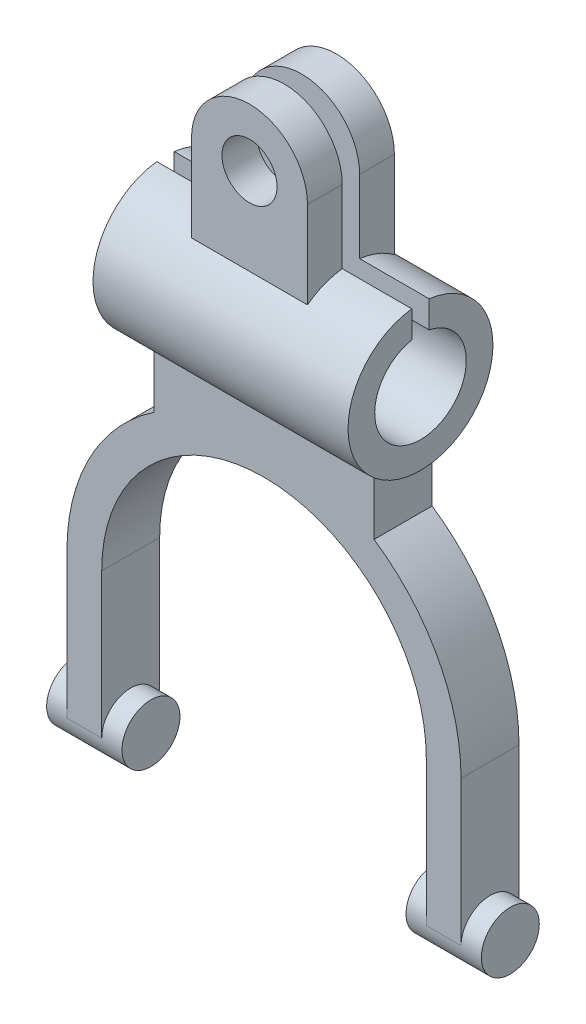
ISO-10303-21;
HEADER;
FILE_DESCRIPTION(('STEP AP214'),'2;1');
FILE_NAME('part.step','',(''),(''),'','','');
FILE_SCHEMA(('AUTOMOTIVE_DESIGN { 1 0 10303 214 1 1 1 1 }'));
ENDSEC;
DATA;
#1=APPLICATION_CONTEXT('core data for automotive mechanical design processes');
#2=APPLICATION_PROTOCOL_DEFINITION('international standard','automotive_design',2000,#1);
#3=PRODUCT_CONTEXT('',#1,'mechanical');
#4=PRODUCT('Part','Part','',(#3));
#5=PRODUCT_RELATED_PRODUCT_CATEGORY('part','',(#4));
#6=PRODUCT_DEFINITION_FORMATION('','',#4);
#7=PRODUCT_DEFINITION_CONTEXT('part definition',#1,'design');
#8=PRODUCT_DEFINITION('design','',#6,#7);
#9=PRODUCT_DEFINITION_SHAPE('','',#8);
#10=(LENGTH_UNIT() NAMED_UNIT(*) SI_UNIT(.MILLI.,.METRE.));
#11=(NAMED_UNIT(*) PLANE_ANGLE_UNIT() SI_UNIT($,.RADIAN.));
#12=(NAMED_UNIT(*) SI_UNIT($,.STERADIAN.) SOLID_ANGLE_UNIT());
#13=UNCERTAINTY_MEASURE_WITH_UNIT(LENGTH_MEASURE(1.E-05),#10,'distance_accuracy_value','');
#14=(GEOMETRIC_REPRESENTATION_CONTEXT(3) GLOBAL_UNCERTAINTY_ASSIGNED_CONTEXT((#13)) GLOBAL_UNIT_ASSIGNED_CONTEXT((#10,
#11,#12)) REPRESENTATION_CONTEXT('',''));
#15=CARTESIAN_POINT('',(0.,0.,0.));
#16=DIRECTION('',(0.,0.,1.));
#17=DIRECTION('',(1.,0.,0.));
#18=AXIS2_PLACEMENT_3D('',#15,#16,#17);
#19=CARTESIAN_POINT('',(22.,0.,0.));
#20=DIRECTION('',(-1.,0.,0.));
#21=DIRECTION('',(0.,0.,1.));
#22=AXIS2_PLACEMENT_3D('',#19,#20,#21);
#23=CYLINDRICAL_SURFACE('',#22,12.5);
#24=CARTESIAN_POINT('',(-19.,0.,0.));
#25=DIRECTION('',(1.,0.,0.));
#26=DIRECTION('',(0.,0.,-1.));
#27=AXIS2_PLACEMENT_3D('',#24,#25,#26);
#28=CIRCLE('',#27,12.5);
#29=CARTESIAN_POINT('',(-19.,-11.4564392373896,5.));
#30=VERTEX_POINT('',#29);
#31=CARTESIAN_POINT('',(-19.,-11.4564392373896,-5.));
#32=VERTEX_POINT('',#31);
#33=EDGE_CURVE('E61',#30,#32,#28,.T.);
#34=ORIENTED_EDGE('',*,*,#33,.F.);
#35=DIRECTION('',(-1.,0.,0.));
#36=VECTOR('',#35,1.);
#37=CARTESIAN_POINT('',(22.,-11.4564392373896,5.));
#38=LINE('',#37,#36);
#39=CARTESIAN_POINT('',(19.,-11.4564392373896,5.));
#40=VERTEX_POINT('',#39);
#41=EDGE_CURVE('E390',#30,#40,#38,.F.);
#42=ORIENTED_EDGE('',*,*,#41,.T.);
#43=CARTESIAN_POINT('',(19.,0.,0.));
#44=DIRECTION('',(-1.,0.,0.));
#45=DIRECTION('',(0.,0.,1.));
#46=AXIS2_PLACEMENT_3D('',#43,#44,#45);
#47=CIRCLE('',#46,12.5);
#48=CARTESIAN_POINT('',(19.,-11.4564392373896,-5.));
#49=VERTEX_POINT('',#48);
#50=EDGE_CURVE('E386',#49,#40,#47,.T.);
#51=ORIENTED_EDGE('',*,*,#50,.F.);
#52=DIRECTION('',(-1.,0.,0.));
#53=VECTOR('',#52,1.);
#54=CARTESIAN_POINT('',(22.,-11.4564392373896,-5.));
#55=LINE('',#54,#53);
#56=EDGE_CURVE('E383',#32,#49,#55,.F.);
#57=ORIENTED_EDGE('',*,*,#56,.F.);
#58=EDGE_LOOP('',(#34,#42,#51,#57));
#59=FACE_BOUND('',#58,.T.);
#60=DIRECTION('',(-1.,0.,0.));
#61=VECTOR('',#60,1.);
#62=CARTESIAN_POINT('',(22.,12.4096736459909,1.5));
#63=LINE('',#62,#61);
#64=CARTESIAN_POINT('',(-22.,12.4096736459909,1.5));
#65=VERTEX_POINT('',#64);
#66=CARTESIAN_POINT('',(-10.,12.4096736459909,1.5));
#67=VERTEX_POINT('',#66);
#68=EDGE_CURVE('E242',#65,#67,#63,.F.);
#69=ORIENTED_EDGE('',*,*,#68,.F.);
#70=CARTESIAN_POINT('',(-22.,0.,0.));
#71=DIRECTION('',(1.,0.,0.));
#72=DIRECTION('',(0.,0.,-1.));
#73=AXIS2_PLACEMENT_3D('',#70,#71,#72);
#74=CIRCLE('',#73,12.5);
#75=CARTESIAN_POINT('',(-22.,12.4096736459909,-1.5));
#76=VERTEX_POINT('',#75);
#77=EDGE_CURVE('E365',#65,#76,#74,.T.);
#78=ORIENTED_EDGE('',*,*,#77,.T.);
#79=DIRECTION('',(-1.,0.,0.));
#80=VECTOR('',#79,1.);
#81=CARTESIAN_POINT('',(22.,12.4096736459909,-1.5));
#82=LINE('',#81,#80);
#83=CARTESIAN_POINT('',(-10.,12.4096736459909,-1.5));
#84=VERTEX_POINT('',#83);
#85=EDGE_CURVE('E231',#84,#76,#82,.T.);
#86=ORIENTED_EDGE('',*,*,#85,.F.);
#87=CARTESIAN_POINT('',(-9.99999999999999,0.,0.));
#88=DIRECTION('',(1.,0.,0.));
#89=DIRECTION('',(0.,1.,0.));
#90=AXIS2_PLACEMENT_3D('',#87,#88,#89);
#91=CIRCLE('',#90,12.5);
#92=CARTESIAN_POINT('',(-10.,10.,-7.5));
#93=VERTEX_POINT('',#92);
#94=EDGE_CURVE('E380',#93,#84,#91,.T.);
#95=ORIENTED_EDGE('',*,*,#94,.F.);
#96=DIRECTION('',(-1.,0.,0.));
#97=VECTOR('',#96,1.);
#98=CARTESIAN_POINT('',(22.,10.,-7.5));
#99=LINE('',#98,#97);
#100=CARTESIAN_POINT('',(10.,10.,-7.5));
#101=VERTEX_POINT('',#100);
#102=EDGE_CURVE('E373',#101,#93,#99,.T.);
#103=ORIENTED_EDGE('',*,*,#102,.F.);
#104=CARTESIAN_POINT('',(10.,0.,0.));
#105=DIRECTION('',(-1.,0.,0.));
#106=DIRECTION('',(0.,0.,1.));
#107=AXIS2_PLACEMENT_3D('',#104,#105,#106);
#108=CIRCLE('',#107,12.5);
#109=CARTESIAN_POINT('',(10.,12.4096736459909,-1.5));
#110=VERTEX_POINT('',#109);
#111=EDGE_CURVE('E367',#110,#101,#108,.T.);
#112=ORIENTED_EDGE('',*,*,#111,.F.);
#113=CARTESIAN_POINT('',(22.,12.4096736459909,-1.5));
#114=VERTEX_POINT('',#113);
#115=EDGE_CURVE('E53',#114,#110,#82,.T.);
#116=ORIENTED_EDGE('',*,*,#115,.F.);
#117=CARTESIAN_POINT('',(22.,0.,0.));
#118=DIRECTION('',(1.,0.,0.));
#119=DIRECTION('',(0.,0.,-1.));
#120=AXIS2_PLACEMENT_3D('',#117,#118,#119);
#121=CIRCLE('',#120,12.5);
#122=CARTESIAN_POINT('',(22.,12.4096736459909,1.5));
#123=VERTEX_POINT('',#122);
#124=EDGE_CURVE('E219',#123,#114,#121,.T.);
#125=ORIENTED_EDGE('',*,*,#124,.F.);
#126=CARTESIAN_POINT('',(10.,12.4096736459909,1.5));
#127=VERTEX_POINT('',#126);
#128=EDGE_CURVE('E239',#127,#123,#63,.F.);
#129=ORIENTED_EDGE('',*,*,#128,.F.);
#130=CARTESIAN_POINT('',(10.,10.,7.5));
#131=VERTEX_POINT('',#130);
#132=EDGE_CURVE('E370',#131,#127,#108,.T.);
#133=ORIENTED_EDGE('',*,*,#132,.F.);
#134=DIRECTION('',(-1.,0.,0.));
#135=VECTOR('',#134,1.);
#136=CARTESIAN_POINT('',(22.,10.,7.5));
#137=LINE('',#136,#135);
#138=CARTESIAN_POINT('',(-10.,10.,7.5));
#139=VERTEX_POINT('',#138);
#140=EDGE_CURVE('E376',#131,#139,#137,.T.);
#141=ORIENTED_EDGE('',*,*,#140,.T.);
#142=EDGE_CURVE('E379',#67,#139,#91,.T.);
#143=ORIENTED_EDGE('',*,*,#142,.F.);
#144=EDGE_LOOP('',(#69,#78,#86,#95,#103,#112,#116,#125,#129,#133,#141,#143));
#145=FACE_BOUND('',#144,.T.);
#146=ADVANCED_FACE('F39',(#59,#145),#23,.T.);
#147=CARTESIAN_POINT('',(22.,0.,0.));
#148=DIRECTION('',(1.,0.,0.));
#149=DIRECTION('',(0.,0.,-1.));
#150=AXIS2_PLACEMENT_3D('',#147,#148,#149);
#151=PLANE('',#150);
#152=CARTESIAN_POINT('',(22.,0.,0.));
#153=DIRECTION('',(1.,0.,0.));
#154=DIRECTION('',(0.,0.,-1.));
#155=AXIS2_PLACEMENT_3D('',#152,#153,#154);
#156=CIRCLE('',#155,7.9);
#157=CARTESIAN_POINT('',(22.,7.75628777186613,1.5));
#158=VERTEX_POINT('',#157);
#159=CARTESIAN_POINT('',(22.,7.75628777186613,-1.5));
#160=VERTEX_POINT('',#159);
#161=EDGE_CURVE('E209',#158,#160,#156,.T.);
#162=ORIENTED_EDGE('',*,*,#161,.F.);
#163=DIRECTION('',(0.,1.,0.));
#164=VECTOR('',#163,1.);
#165=CARTESIAN_POINT('',(22.,0.,1.5));
#166=LINE('',#165,#164);
#167=EDGE_CURVE('E206',#158,#123,#166,.T.);
#168=ORIENTED_EDGE('',*,*,#167,.T.);
#169=ORIENTED_EDGE('',*,*,#124,.T.);
#170=DIRECTION('',(0.,-1.,0.));
#171=VECTOR('',#170,1.);
#172=CARTESIAN_POINT('',(22.,0.,-1.5));
#173=LINE('',#172,#171);
#174=EDGE_CURVE('E201',#114,#160,#173,.T.);
#175=ORIENTED_EDGE('',*,*,#174,.T.);
#176=EDGE_LOOP('',(#162,#168,#169,#175));
#177=FACE_BOUND('',#176,.T.);
#178=ADVANCED_FACE('F217',(#177),#151,.T.);
#179=CARTESIAN_POINT('',(-22.,0.,0.));
#180=DIRECTION('',(1.,0.,0.));
#181=DIRECTION('',(0.,0.,-1.));
#182=AXIS2_PLACEMENT_3D('',#179,#180,#181);
#183=PLANE('',#182);
#184=DIRECTION('',(0.,1.,0.));
#185=VECTOR('',#184,1.);
#186=CARTESIAN_POINT('',(-22.,0.,1.5));
#187=LINE('',#186,#185);
#188=CARTESIAN_POINT('',(-22.,7.75628777186613,1.5));
#189=VERTEX_POINT('',#188);
#190=EDGE_CURVE('E244',#189,#65,#187,.T.);
#191=ORIENTED_EDGE('',*,*,#190,.F.);
#192=CARTESIAN_POINT('',(-22.,0.,0.));
#193=DIRECTION('',(1.,0.,0.));
#194=DIRECTION('',(0.,0.,-1.));
#195=AXIS2_PLACEMENT_3D('',#192,#193,#194);
#196=CIRCLE('',#195,7.9);
#197=CARTESIAN_POINT('',(-22.,7.75628777186613,-1.5));
#198=VERTEX_POINT('',#197);
#199=EDGE_CURVE('E11',#189,#198,#196,.T.);
#200=ORIENTED_EDGE('',*,*,#199,.T.);
#201=DIRECTION('',(0.,-1.,0.));
#202=VECTOR('',#201,1.);
#203=CARTESIAN_POINT('',(-22.,0.,-1.5));
#204=LINE('',#203,#202);
#205=EDGE_CURVE('E203',#76,#198,#204,.T.);
#206=ORIENTED_EDGE('',*,*,#205,.F.);
#207=ORIENTED_EDGE('',*,*,#77,.F.);
#208=EDGE_LOOP('',(#191,#200,#206,#207));
#209=FACE_BOUND('',#208,.T.);
#210=ADVANCED_FACE('F415',(#209),#183,.F.);
#211=CARTESIAN_POINT('',(0.,25.,7.5));
#212=DIRECTION('',(0.,0.,-1.));
#213=DIRECTION('',(-1.,0.,0.));
#214=AXIS2_PLACEMENT_3D('',#211,#212,#213);
#215=CYLINDRICAL_SURFACE('',#214,10.);
#216=CARTESIAN_POINT('',(0.,25.,1.5));
#217=DIRECTION('',(0.,0.,-1.));
#218=DIRECTION('',(-1.,0.,0.));
#219=AXIS2_PLACEMENT_3D('',#216,#217,#218);
#220=CIRCLE('',#219,10.);
#221=CARTESIAN_POINT('',(-10.,25.,1.5));
#222=VERTEX_POINT('',#221);
#223=CARTESIAN_POINT('',(10.,25.,1.5));
#224=VERTEX_POINT('',#223);
#225=EDGE_CURVE('E237',#222,#224,#220,.T.);
#226=ORIENTED_EDGE('',*,*,#225,.F.);
#227=DIRECTION('',(0.,0.,-1.));
#228=VECTOR('',#227,1.);
#229=CARTESIAN_POINT('',(-10.,25.,7.5));
#230=LINE('',#229,#228);
#231=CARTESIAN_POINT('',(-10.,25.,7.5));
#232=VERTEX_POINT('',#231);
#233=EDGE_CURVE('E362',#232,#222,#230,.T.);
#234=ORIENTED_EDGE('',*,*,#233,.F.);
#235=CARTESIAN_POINT('',(0.,25.,7.5));
#236=DIRECTION('',(0.,0.,1.));
#237=DIRECTION('',(1.,0.,0.));
#238=AXIS2_PLACEMENT_3D('',#235,#236,#237);
#239=CIRCLE('',#238,10.);
#240=CARTESIAN_POINT('',(10.,25.,7.5));
#241=VERTEX_POINT('',#240);
#242=EDGE_CURVE('E341',#241,#232,#239,.T.);
#243=ORIENTED_EDGE('',*,*,#242,.F.);
#244=DIRECTION('',(0.,0.,-1.));
#245=VECTOR('',#244,1.);
#246=CARTESIAN_POINT('',(10.,25.,7.5));
#247=LINE('',#246,#245);
#248=EDGE_CURVE('E358',#241,#224,#247,.T.);
#249=ORIENTED_EDGE('',*,*,#248,.T.);
#250=EDGE_LOOP('',(#226,#234,#243,#249));
#251=FACE_BOUND('',#250,.T.);
#252=ADVANCED_FACE('F417',(#251),#215,.T.);
#253=CARTESIAN_POINT('',(0.,25.,-1.49999999999999));
#254=DIRECTION('',(0.,0.,1.));
#255=DIRECTION('',(0.,-1.,0.));
#256=AXIS2_PLACEMENT_3D('',#253,#254,#255);
#257=CIRCLE('',#256,10.);
#258=CARTESIAN_POINT('',(10.,25.,-1.49999999999999));
#259=VERTEX_POINT('',#258);
#260=CARTESIAN_POINT('',(-10.,25.,-1.49999999999999));
#261=VERTEX_POINT('',#260);
#262=EDGE_CURVE('E227',#259,#261,#257,.T.);
#263=ORIENTED_EDGE('',*,*,#262,.F.);
#264=CARTESIAN_POINT('',(10.,25.,-7.5));
#265=VERTEX_POINT('',#264);
#266=EDGE_CURVE('E350',#259,#265,#247,.T.);
#267=ORIENTED_EDGE('',*,*,#266,.T.);
#268=CARTESIAN_POINT('',(0.,25.,-7.5));
#269=DIRECTION('',(0.,0.,1.));
#270=DIRECTION('',(1.,0.,0.));
#271=AXIS2_PLACEMENT_3D('',#268,#269,#270);
#272=CIRCLE('',#271,10.);
#273=CARTESIAN_POINT('',(-10.,25.,-7.5));
#274=VERTEX_POINT('',#273);
#275=EDGE_CURVE('E338',#265,#274,#272,.T.);
#276=ORIENTED_EDGE('',*,*,#275,.T.);
#277=EDGE_CURVE('E361',#261,#274,#230,.T.);
#278=ORIENTED_EDGE('',*,*,#277,.F.);
#279=EDGE_LOOP('',(#263,#267,#276,#278));
#280=FACE_BOUND('',#279,.T.);
#281=ADVANCED_FACE('F422',(#280),#215,.T.);
#282=CARTESIAN_POINT('',(-10.,25.,7.5));
#283=DIRECTION('',(1.,0.,0.));
#284=DIRECTION('',(0.,1.,0.));
#285=AXIS2_PLACEMENT_3D('',#282,#283,#284);
#286=PLANE('',#285);
#287=DIRECTION('',(0.,1.,0.));
#288=VECTOR('',#287,1.);
#289=CARTESIAN_POINT('',(-10.,25.,1.5));
#290=LINE('',#289,#288);
#291=EDGE_CURVE('E241',#67,#222,#290,.T.);
#292=ORIENTED_EDGE('',*,*,#291,.F.);
#293=ORIENTED_EDGE('',*,*,#142,.T.);
#294=DIRECTION('',(0.,-1.,0.));
#295=VECTOR('',#294,1.);
#296=CARTESIAN_POINT('',(-10.,25.,7.5));
#297=LINE('',#296,#295);
#298=EDGE_CURVE('E344',#232,#139,#297,.T.);
#299=ORIENTED_EDGE('',*,*,#298,.F.);
#300=ORIENTED_EDGE('',*,*,#233,.T.);
#301=EDGE_LOOP('',(#292,#293,#299,#300));
#302=FACE_BOUND('',#301,.T.);
#303=ADVANCED_FACE('F458',(#302),#286,.F.);
#304=DIRECTION('',(0.,-1.,0.));
#305=VECTOR('',#304,1.);
#306=CARTESIAN_POINT('',(-10.,25.,-1.49999999999999));
#307=LINE('',#306,#305);
#308=EDGE_CURVE('E230',#261,#84,#307,.T.);
#309=ORIENTED_EDGE('',*,*,#308,.F.);
#310=ORIENTED_EDGE('',*,*,#277,.T.);
#311=DIRECTION('',(0.,-1.,0.));
#312=VECTOR('',#311,1.);
#313=CARTESIAN_POINT('',(-10.,25.,-7.5));
#314=LINE('',#313,#312);
#315=EDGE_CURVE('E353',#274,#93,#314,.T.);
#316=ORIENTED_EDGE('',*,*,#315,.T.);
#317=ORIENTED_EDGE('',*,*,#94,.T.);
#318=EDGE_LOOP('',(#309,#310,#316,#317));
#319=FACE_BOUND('',#318,.T.);
#320=ADVANCED_FACE('F467',(#319),#286,.F.);
#321=CARTESIAN_POINT('',(10.,0.,7.5));
#322=DIRECTION('',(-1.,0.,0.));
#323=DIRECTION('',(0.,0.,1.));
#324=AXIS2_PLACEMENT_3D('',#321,#322,#323);
#325=PLANE('',#324);
#326=DIRECTION('',(0.,-1.,0.));
#327=VECTOR('',#326,1.);
#328=CARTESIAN_POINT('',(10.,0.,1.5));
#329=LINE('',#328,#327);
#330=EDGE_CURVE('E235',#224,#127,#329,.T.);
#331=ORIENTED_EDGE('',*,*,#330,.F.);
#332=ORIENTED_EDGE('',*,*,#248,.F.);
#333=DIRECTION('',(0.,1.,0.));
#334=VECTOR('',#333,1.);
#335=CARTESIAN_POINT('',(10.,0.,7.5));
#336=LINE('',#335,#334);
#337=EDGE_CURVE('E348',#131,#241,#336,.T.);
#338=ORIENTED_EDGE('',*,*,#337,.F.);
#339=ORIENTED_EDGE('',*,*,#132,.T.);
#340=EDGE_LOOP('',(#331,#332,#338,#339));
#341=FACE_BOUND('',#340,.T.);
#342=ADVANCED_FACE('F477',(#341),#325,.F.);
#343=DIRECTION('',(0.,1.,0.));
#344=VECTOR('',#343,1.);
#345=CARTESIAN_POINT('',(10.,0.,-1.5));
#346=LINE('',#345,#344);
#347=EDGE_CURVE('E225',#110,#259,#346,.T.);
#348=ORIENTED_EDGE('',*,*,#347,.F.);
#349=ORIENTED_EDGE('',*,*,#111,.T.);
#350=DIRECTION('',(0.,1.,0.));
#351=VECTOR('',#350,1.);
#352=CARTESIAN_POINT('',(10.,0.,-7.5));
#353=LINE('',#352,#351);
#354=EDGE_CURVE('E345',#101,#265,#353,.T.);
#355=ORIENTED_EDGE('',*,*,#354,.T.);
#356=ORIENTED_EDGE('',*,*,#266,.F.);
#357=EDGE_LOOP('',(#348,#349,#355,#356));
#358=FACE_BOUND('',#357,.T.);
#359=ADVANCED_FACE('F486',(#358),#325,.F.);
#360=CARTESIAN_POINT('',(0.,25.,7.5));
#361=DIRECTION('',(0.,0.,-1.));
#362=DIRECTION('',(-1.,0.,0.));
#363=AXIS2_PLACEMENT_3D('',#360,#361,#362);
#364=CYLINDRICAL_SURFACE('',#363,4.75);
#365=CARTESIAN_POINT('',(0.,25.,7.5));
#366=DIRECTION('',(0.,0.,1.));
#367=DIRECTION('',(1.,0.,0.));
#368=AXIS2_PLACEMENT_3D('',#365,#366,#367);
#369=CIRCLE('',#368,4.75);
#370=CARTESIAN_POINT('',(4.75,25.,7.5));
#371=VERTEX_POINT('',#370);
#372=EDGE_CURVE('E335',#371,#371,#369,.T.);
#373=ORIENTED_EDGE('',*,*,#372,.T.);
#374=EDGE_LOOP('',(#373));
#375=FACE_BOUND('',#374,.T.);
#376=CARTESIAN_POINT('',(0.,25.,1.5));
#377=DIRECTION('',(0.,0.,-1.));
#378=DIRECTION('',(-1.,0.,0.));
#379=AXIS2_PLACEMENT_3D('',#376,#377,#378);
#380=CIRCLE('',#379,4.75);
#381=CARTESIAN_POINT('',(-4.75,25.,1.5));
#382=VERTEX_POINT('',#381);
#383=EDGE_CURVE('E234',#382,#382,#380,.T.);
#384=ORIENTED_EDGE('',*,*,#383,.T.);
#385=EDGE_LOOP('',(#384));
#386=FACE_BOUND('',#385,.T.);
#387=ADVANCED_FACE('F401',(#375,#386),#364,.F.);
#388=CARTESIAN_POINT('',(0.,25.,-7.5));
#389=DIRECTION('',(0.,0.,1.));
#390=DIRECTION('',(1.,0.,0.));
#391=AXIS2_PLACEMENT_3D('',#388,#389,#390);
#392=CIRCLE('',#391,4.75);
#393=CARTESIAN_POINT('',(4.75,25.,-7.5));
#394=VERTEX_POINT('',#393);
#395=EDGE_CURVE('E334',#394,#394,#392,.T.);
#396=ORIENTED_EDGE('',*,*,#395,.F.);
#397=EDGE_LOOP('',(#396));
#398=FACE_BOUND('',#397,.T.);
#399=CARTESIAN_POINT('',(0.,25.,-1.49999999999999));
#400=DIRECTION('',(0.,0.,1.));
#401=DIRECTION('',(0.,-1.,0.));
#402=AXIS2_PLACEMENT_3D('',#399,#400,#401);
#403=CIRCLE('',#402,4.75);
#404=CARTESIAN_POINT('',(0.,20.25,-1.49999999999999));
#405=VERTEX_POINT('',#404);
#406=EDGE_CURVE('E223',#405,#405,#403,.T.);
#407=ORIENTED_EDGE('',*,*,#406,.T.);
#408=EDGE_LOOP('',(#407));
#409=FACE_BOUND('',#408,.T.);
#410=ADVANCED_FACE('F504',(#398,#409),#364,.F.);
#411=CARTESIAN_POINT('',(0.,25.,7.5));
#412=DIRECTION('',(0.,0.,1.));
#413=DIRECTION('',(1.,0.,0.));
#414=AXIS2_PLACEMENT_3D('',#411,#412,#413);
#415=PLANE('',#414);
#416=ORIENTED_EDGE('',*,*,#372,.F.);
#417=EDGE_LOOP('',(#416));
#418=FACE_BOUND('',#417,.T.);
#419=ORIENTED_EDGE('',*,*,#140,.F.);
#420=ORIENTED_EDGE('',*,*,#337,.T.);
#421=ORIENTED_EDGE('',*,*,#242,.T.);
#422=ORIENTED_EDGE('',*,*,#298,.T.);
#423=EDGE_LOOP('',(#419,#420,#421,#422));
#424=FACE_BOUND('',#423,.T.);
#425=ADVANCED_FACE('F514',(#418,#424),#415,.T.);
#426=CARTESIAN_POINT('',(0.,25.,-7.5));
#427=DIRECTION('',(0.,0.,1.));
#428=DIRECTION('',(1.,0.,0.));
#429=AXIS2_PLACEMENT_3D('',#426,#427,#428);
#430=PLANE('',#429);
#431=ORIENTED_EDGE('',*,*,#395,.T.);
#432=EDGE_LOOP('',(#431));
#433=FACE_BOUND('',#432,.T.);
#434=ORIENTED_EDGE('',*,*,#354,.F.);
#435=ORIENTED_EDGE('',*,*,#102,.T.);
#436=ORIENTED_EDGE('',*,*,#315,.F.);
#437=ORIENTED_EDGE('',*,*,#275,.F.);
#438=EDGE_LOOP('',(#434,#435,#436,#437));
#439=FACE_BOUND('',#438,.T.);
#440=ADVANCED_FACE('F665',(#433,#439),#430,.F.);
#441=CARTESIAN_POINT('',(0.,-50.,5.));
#442=DIRECTION('',(0.,0.,1.));
#443=DIRECTION('',(1.,0.,0.));
#444=AXIS2_PLACEMENT_3D('',#441,#442,#443);
#445=PLANE('',#444);
#446=ORIENTED_EDGE('',*,*,#41,.F.);
#447=DIRECTION('',(0.,-1.,0.));
#448=VECTOR('',#447,1.);
#449=CARTESIAN_POINT('',(-19.,-8.5,5.));
#450=LINE('',#449,#448);
#451=CARTESIAN_POINT('',(-19.,-21.8042556402566,5.));
#452=VERTEX_POINT('',#451);
#453=EDGE_CURVE('E265',#30,#452,#450,.T.);
#454=ORIENTED_EDGE('',*,*,#453,.T.);
#455=CARTESIAN_POINT('',(0.,-50.,5.));
#456=DIRECTION('',(0.,0.,1.));
#457=DIRECTION('',(1.,0.,0.));
#458=AXIS2_PLACEMENT_3D('',#455,#456,#457);
#459=CIRCLE('',#458,34.);
#460=CARTESIAN_POINT('',(-34.,-50.,5.));
#461=VERTEX_POINT('',#460);
#462=EDGE_CURVE('E267',#452,#461,#459,.T.);
#463=ORIENTED_EDGE('',*,*,#462,.T.);
#464=DIRECTION('',(0.,-1.,0.));
#465=VECTOR('',#464,1.);
#466=CARTESIAN_POINT('',(-34.,-50.,5.));
#467=LINE('',#466,#465);
#468=CARTESIAN_POINT('',(-34.,-75.,5.));
#469=VERTEX_POINT('',#468);
#470=EDGE_CURVE('E270',#461,#469,#467,.T.);
#471=ORIENTED_EDGE('',*,*,#470,.T.);
#472=DIRECTION('',(1.,0.,0.));
#473=VECTOR('',#472,1.);
#474=CARTESIAN_POINT('',(-28.,-75.,5.));
#475=LINE('',#474,#473);
#476=CARTESIAN_POINT('',(-28.,-75.,5.));
#477=VERTEX_POINT('',#476);
#478=EDGE_CURVE('E273',#469,#477,#475,.T.);
#479=ORIENTED_EDGE('',*,*,#478,.T.);
#480=DIRECTION('',(0.,1.,0.));
#481=VECTOR('',#480,1.);
#482=CARTESIAN_POINT('',(-28.,-50.,5.));
#483=LINE('',#482,#481);
#484=CARTESIAN_POINT('',(-28.,-50.,5.));
#485=VERTEX_POINT('',#484);
#486=EDGE_CURVE('E276',#477,#485,#483,.T.);
#487=ORIENTED_EDGE('',*,*,#486,.T.);
#488=CARTESIAN_POINT('',(0.,-50.,5.));
#489=DIRECTION('',(0.,0.,-1.));
#490=DIRECTION('',(1.,0.,0.));
#491=AXIS2_PLACEMENT_3D('',#488,#489,#490);
#492=CIRCLE('',#491,28.);
#493=CARTESIAN_POINT('',(28.,-50.,5.));
#494=VERTEX_POINT('',#493);
#495=EDGE_CURVE('E278',#485,#494,#492,.T.);
#496=ORIENTED_EDGE('',*,*,#495,.T.);
#497=DIRECTION('',(0.,-1.,0.));
#498=VECTOR('',#497,1.);
#499=CARTESIAN_POINT('',(28.,-50.,5.));
#500=LINE('',#499,#498);
#501=CARTESIAN_POINT('',(28.,-75.,5.));
#502=VERTEX_POINT('',#501);
#503=EDGE_CURVE('E280',#494,#502,#500,.T.);
#504=ORIENTED_EDGE('',*,*,#503,.T.);
#505=DIRECTION('',(1.,0.,0.));
#506=VECTOR('',#505,1.);
#507=CARTESIAN_POINT('',(28.,-75.,5.));
#508=LINE('',#507,#506);
#509=CARTESIAN_POINT('',(34.,-75.,5.));
#510=VERTEX_POINT('',#509);
#511=EDGE_CURVE('E283',#502,#510,#508,.T.);
#512=ORIENTED_EDGE('',*,*,#511,.T.);
#513=DIRECTION('',(0.,1.,0.));
#514=VECTOR('',#513,1.);
#515=CARTESIAN_POINT('',(34.,-50.,5.));
#516=LINE('',#515,#514);
#517=CARTESIAN_POINT('',(34.,-50.,5.));
#518=VERTEX_POINT('',#517);
#519=EDGE_CURVE('E286',#510,#518,#516,.T.);
#520=ORIENTED_EDGE('',*,*,#519,.T.);
#521=CARTESIAN_POINT('',(0.,-50.,5.));
#522=DIRECTION('',(0.,0.,1.));
#523=DIRECTION('',(1.,0.,0.));
#524=AXIS2_PLACEMENT_3D('',#521,#522,#523);
#525=CIRCLE('',#524,34.);
#526=CARTESIAN_POINT('',(19.,-21.8042556402566,5.));
#527=VERTEX_POINT('',#526);
#528=EDGE_CURVE('E288',#518,#527,#525,.T.);
#529=ORIENTED_EDGE('',*,*,#528,.T.);
#530=DIRECTION('',(0.,1.,0.));
#531=VECTOR('',#530,1.);
#532=CARTESIAN_POINT('',(19.,-8.5,5.));
#533=LINE('',#532,#531);
#534=EDGE_CURVE('E290',#527,#40,#533,.T.);
#535=ORIENTED_EDGE('',*,*,#534,.T.);
#536=EDGE_LOOP('',(#446,#454,#463,#471,#479,#487,#496,#504,#512,#520,#529,#535));
#537=FACE_BOUND('',#536,.T.);
#538=ADVANCED_FACE('F656',(#537),#445,.T.);
#539=CARTESIAN_POINT('',(0.,-50.,-5.));
#540=DIRECTION('',(0.,0.,1.));
#541=DIRECTION('',(1.,0.,0.));
#542=AXIS2_PLACEMENT_3D('',#539,#540,#541);
#543=PLANE('',#542);
#544=DIRECTION('',(0.,-1.,0.));
#545=VECTOR('',#544,1.);
#546=CARTESIAN_POINT('',(-19.,-8.5,-5.));
#547=LINE('',#546,#545);
#548=CARTESIAN_POINT('',(-19.,-21.8042556402566,-5.));
#549=VERTEX_POINT('',#548);
#550=EDGE_CURVE('E264',#32,#549,#547,.T.);
#551=ORIENTED_EDGE('',*,*,#550,.F.);
#552=ORIENTED_EDGE('',*,*,#56,.T.);
#553=DIRECTION('',(0.,1.,0.));
#554=VECTOR('',#553,1.);
#555=CARTESIAN_POINT('',(19.,-8.5,-5.));
#556=LINE('',#555,#554);
#557=CARTESIAN_POINT('',(19.,-21.8042556402566,-5.));
#558=VERTEX_POINT('',#557);
#559=EDGE_CURVE('E268',#558,#49,#556,.T.);
#560=ORIENTED_EDGE('',*,*,#559,.F.);
#561=CARTESIAN_POINT('',(0.,-50.,-5.));
#562=DIRECTION('',(0.,0.,1.));
#563=DIRECTION('',(1.,0.,0.));
#564=AXIS2_PLACEMENT_3D('',#561,#562,#563);
#565=CIRCLE('',#564,34.);
#566=CARTESIAN_POINT('',(34.,-50.,-5.));
#567=VERTEX_POINT('',#566);
#568=EDGE_CURVE('E313',#567,#558,#565,.T.);
#569=ORIENTED_EDGE('',*,*,#568,.F.);
#570=DIRECTION('',(0.,1.,0.));
#571=VECTOR('',#570,1.);
#572=CARTESIAN_POINT('',(34.,-50.,-5.));
#573=LINE('',#572,#571);
#574=CARTESIAN_POINT('',(34.,-75.,-5.));
#575=VERTEX_POINT('',#574);
#576=EDGE_CURVE('E311',#575,#567,#573,.T.);
#577=ORIENTED_EDGE('',*,*,#576,.F.);
#578=DIRECTION('',(1.,0.,0.));
#579=VECTOR('',#578,1.);
#580=CARTESIAN_POINT('',(28.,-75.,-5.));
#581=LINE('',#580,#579);
#582=CARTESIAN_POINT('',(28.,-75.,-5.));
#583=VERTEX_POINT('',#582);
#584=EDGE_CURVE('E309',#583,#575,#581,.T.);
#585=ORIENTED_EDGE('',*,*,#584,.F.);
#586=DIRECTION('',(0.,-1.,0.));
#587=VECTOR('',#586,1.);
#588=CARTESIAN_POINT('',(28.,-50.,-5.));
#589=LINE('',#588,#587);
#590=CARTESIAN_POINT('',(28.,-50.,-5.));
#591=VERTEX_POINT('',#590);
#592=EDGE_CURVE('E306',#591,#583,#589,.T.);
#593=ORIENTED_EDGE('',*,*,#592,.F.);
#594=CARTESIAN_POINT('',(0.,-50.,-5.));
#595=DIRECTION('',(0.,0.,-1.));
#596=DIRECTION('',(1.,0.,0.));
#597=AXIS2_PLACEMENT_3D('',#594,#595,#596);
#598=CIRCLE('',#597,28.);
#599=CARTESIAN_POINT('',(-28.,-50.,-5.));
#600=VERTEX_POINT('',#599);
#601=EDGE_CURVE('E304',#600,#591,#598,.T.);
#602=ORIENTED_EDGE('',*,*,#601,.F.);
#603=DIRECTION('',(0.,1.,0.));
#604=VECTOR('',#603,1.);
#605=CARTESIAN_POINT('',(-28.,-50.,-5.));
#606=LINE('',#605,#604);
#607=CARTESIAN_POINT('',(-28.,-75.,-5.));
#608=VERTEX_POINT('',#607);
#609=EDGE_CURVE('E302',#608,#600,#606,.T.);
#610=ORIENTED_EDGE('',*,*,#609,.F.);
#611=DIRECTION('',(1.,0.,0.));
#612=VECTOR('',#611,1.);
#613=CARTESIAN_POINT('',(-28.,-75.,-5.));
#614=LINE('',#613,#612);
#615=CARTESIAN_POINT('',(-34.,-75.,-5.));
#616=VERTEX_POINT('',#615);
#617=EDGE_CURVE('E299',#616,#608,#614,.T.);
#618=ORIENTED_EDGE('',*,*,#617,.F.);
#619=DIRECTION('',(0.,-1.,0.));
#620=VECTOR('',#619,1.);
#621=CARTESIAN_POINT('',(-34.,-50.,-5.));
#622=LINE('',#621,#620);
#623=CARTESIAN_POINT('',(-34.,-50.,-5.));
#624=VERTEX_POINT('',#623);
#625=EDGE_CURVE('E297',#624,#616,#622,.T.);
#626=ORIENTED_EDGE('',*,*,#625,.F.);
#627=CARTESIAN_POINT('',(0.,-50.,-5.));
#628=DIRECTION('',(0.,0.,1.));
#629=DIRECTION('',(1.,0.,0.));
#630=AXIS2_PLACEMENT_3D('',#627,#628,#629);
#631=CIRCLE('',#630,34.);
#632=EDGE_CURVE('E295',#549,#624,#631,.T.);
#633=ORIENTED_EDGE('',*,*,#632,.F.);
#634=EDGE_LOOP('',(#551,#552,#560,#569,#577,#585,#593,#602,#610,#618,#626,#633));
#635=FACE_BOUND('',#634,.T.);
#636=ADVANCED_FACE('F647',(#635),#543,.F.);
#637=CARTESIAN_POINT('',(-19.,-8.5,5.));
#638=DIRECTION('',(1.,0.,0.));
#639=DIRECTION('',(0.,0.,-1.));
#640=AXIS2_PLACEMENT_3D('',#637,#638,#639);
#641=PLANE('',#640);
#642=ORIENTED_EDGE('',*,*,#453,.F.);
#643=ORIENTED_EDGE('',*,*,#33,.T.);
#644=ORIENTED_EDGE('',*,*,#550,.T.);
#645=DIRECTION('',(0.,0.,-1.));
#646=VECTOR('',#645,1.);
#647=CARTESIAN_POINT('',(-19.,-21.8042556402566,5.));
#648=LINE('',#647,#646);
#649=EDGE_CURVE('E331',#452,#549,#648,.T.);
#650=ORIENTED_EDGE('',*,*,#649,.F.);
#651=EDGE_LOOP('',(#642,#643,#644,#650));
#652=FACE_BOUND('',#651,.T.);
#653=ADVANCED_FACE('F638',(#652),#641,.F.);
#654=CARTESIAN_POINT('',(0.,-50.,5.));
#655=DIRECTION('',(0.,0.,-1.));
#656=DIRECTION('',(-1.,0.,0.));
#657=AXIS2_PLACEMENT_3D('',#654,#655,#656);
#658=CYLINDRICAL_SURFACE('',#657,34.);
#659=ORIENTED_EDGE('',*,*,#632,.T.);
#660=DIRECTION('',(0.,0.,-1.));
#661=VECTOR('',#660,1.);
#662=CARTESIAN_POINT('',(-34.,-50.,5.));
#663=LINE('',#662,#661);
#664=EDGE_CURVE('E328',#461,#624,#663,.T.);
#665=ORIENTED_EDGE('',*,*,#664,.F.);
#666=ORIENTED_EDGE('',*,*,#462,.F.);
#667=ORIENTED_EDGE('',*,*,#649,.T.);
#668=EDGE_LOOP('',(#659,#665,#666,#667));
#669=FACE_BOUND('',#668,.T.);
#670=ADVANCED_FACE('F629',(#669),#658,.T.);
#671=CARTESIAN_POINT('',(-34.,-50.,5.));
#672=DIRECTION('',(1.,0.,0.));
#673=DIRECTION('',(0.,0.,-1.));
#674=AXIS2_PLACEMENT_3D('',#671,#672,#673);
#675=PLANE('',#674);
#676=CARTESIAN_POINT('',(-34.,-75.,0.));
#677=DIRECTION('',(1.,0.,0.));
#678=DIRECTION('',(0.,0.,-1.));
#679=AXIS2_PLACEMENT_3D('',#676,#677,#678);
#680=CIRCLE('',#679,5.);
#681=EDGE_CURVE('E252',#469,#616,#680,.F.);
#682=ORIENTED_EDGE('',*,*,#681,.F.);
#683=ORIENTED_EDGE('',*,*,#470,.F.);
#684=ORIENTED_EDGE('',*,*,#664,.T.);
#685=ORIENTED_EDGE('',*,*,#625,.T.);
#686=EDGE_LOOP('',(#682,#683,#684,#685));
#687=FACE_BOUND('',#686,.T.);
#688=ADVANCED_FACE('F620',(#687),#675,.F.);
#689=CARTESIAN_POINT('',(-28.,-50.,5.));
#690=DIRECTION('',(-1.,0.,0.));
#691=DIRECTION('',(0.,0.,1.));
#692=AXIS2_PLACEMENT_3D('',#689,#690,#691);
#693=PLANE('',#692);
#694=CARTESIAN_POINT('',(-28.,-75.,0.));
#695=DIRECTION('',(-1.,0.,0.));
#696=DIRECTION('',(0.,0.,1.));
#697=AXIS2_PLACEMENT_3D('',#694,#695,#696);
#698=CIRCLE('',#697,5.);
#699=EDGE_CURVE('E46',#608,#477,#698,.F.);
#700=ORIENTED_EDGE('',*,*,#699,.F.);
#701=ORIENTED_EDGE('',*,*,#609,.T.);
#702=DIRECTION('',(0.,0.,-1.));
#703=VECTOR('',#702,1.);
#704=CARTESIAN_POINT('',(-28.,-50.,5.));
#705=LINE('',#704,#703);
#706=EDGE_CURVE('E325',#485,#600,#705,.T.);
#707=ORIENTED_EDGE('',*,*,#706,.F.);
#708=ORIENTED_EDGE('',*,*,#486,.F.);
#709=EDGE_LOOP('',(#700,#701,#707,#708));
#710=FACE_BOUND('',#709,.T.);
#711=ADVANCED_FACE('F611',(#710),#693,.F.);
#712=CARTESIAN_POINT('',(0.,-50.,5.));
#713=DIRECTION('',(0.,0.,-1.));
#714=DIRECTION('',(-1.,0.,0.));
#715=AXIS2_PLACEMENT_3D('',#712,#713,#714);
#716=CYLINDRICAL_SURFACE('',#715,28.);
#717=ORIENTED_EDGE('',*,*,#601,.T.);
#718=DIRECTION('',(0.,0.,-1.));
#719=VECTOR('',#718,1.);
#720=CARTESIAN_POINT('',(28.,-50.,5.));
#721=LINE('',#720,#719);
#722=EDGE_CURVE('E322',#494,#591,#721,.T.);
#723=ORIENTED_EDGE('',*,*,#722,.F.);
#724=ORIENTED_EDGE('',*,*,#495,.F.);
#725=ORIENTED_EDGE('',*,*,#706,.T.);
#726=EDGE_LOOP('',(#717,#723,#724,#725));
#727=FACE_BOUND('',#726,.T.);
#728=ADVANCED_FACE('F602',(#727),#716,.F.);
#729=CARTESIAN_POINT('',(28.,-50.,5.));
#730=DIRECTION('',(1.,0.,0.));
#731=DIRECTION('',(0.,1.,0.));
#732=AXIS2_PLACEMENT_3D('',#729,#730,#731);
#733=PLANE('',#732);
#734=ORIENTED_EDGE('',*,*,#592,.T.);
#735=CARTESIAN_POINT('',(28.,-75.,0.));
#736=DIRECTION('',(1.,0.,0.));
#737=DIRECTION('',(0.,1.,0.));
#738=AXIS2_PLACEMENT_3D('',#735,#736,#737);
#739=CIRCLE('',#738,5.);
#740=EDGE_CURVE('E261',#583,#502,#739,.T.);
#741=ORIENTED_EDGE('',*,*,#740,.T.);
#742=ORIENTED_EDGE('',*,*,#503,.F.);
#743=ORIENTED_EDGE('',*,*,#722,.T.);
#744=EDGE_LOOP('',(#734,#741,#742,#743));
#745=FACE_BOUND('',#744,.T.);
#746=ADVANCED_FACE('F593',(#745),#733,.F.);
#747=CARTESIAN_POINT('',(34.,-50.,5.));
#748=DIRECTION('',(-1.,0.,0.));
#749=DIRECTION('',(0.,0.,1.));
#750=AXIS2_PLACEMENT_3D('',#747,#748,#749);
#751=PLANE('',#750);
#752=ORIENTED_EDGE('',*,*,#519,.F.);
#753=CARTESIAN_POINT('',(34.,-75.,0.));
#754=DIRECTION('',(-1.,0.,0.));
#755=DIRECTION('',(0.,0.,1.));
#756=AXIS2_PLACEMENT_3D('',#753,#754,#755);
#757=CIRCLE('',#756,5.);
#758=EDGE_CURVE('E392',#510,#575,#757,.T.);
#759=ORIENTED_EDGE('',*,*,#758,.T.);
#760=ORIENTED_EDGE('',*,*,#576,.T.);
#761=DIRECTION('',(0.,0.,-1.));
#762=VECTOR('',#761,1.);
#763=CARTESIAN_POINT('',(34.,-50.,5.));
#764=LINE('',#763,#762);
#765=EDGE_CURVE('E319',#518,#567,#764,.T.);
#766=ORIENTED_EDGE('',*,*,#765,.F.);
#767=EDGE_LOOP('',(#752,#759,#760,#766));
#768=FACE_BOUND('',#767,.T.);
#769=ADVANCED_FACE('F584',(#768),#751,.F.);
#770=CARTESIAN_POINT('',(0.,-50.,5.));
#771=DIRECTION('',(0.,0.,-1.));
#772=DIRECTION('',(-1.,0.,0.));
#773=AXIS2_PLACEMENT_3D('',#770,#771,#772);
#774=CYLINDRICAL_SURFACE('',#773,34.);
#775=ORIENTED_EDGE('',*,*,#568,.T.);
#776=DIRECTION('',(0.,0.,-1.));
#777=VECTOR('',#776,1.);
#778=CARTESIAN_POINT('',(19.,-21.8042556402566,5.));
#779=LINE('',#778,#777);
#780=EDGE_CURVE('E293',#527,#558,#779,.T.);
#781=ORIENTED_EDGE('',*,*,#780,.F.);
#782=ORIENTED_EDGE('',*,*,#528,.F.);
#783=ORIENTED_EDGE('',*,*,#765,.T.);
#784=EDGE_LOOP('',(#775,#781,#782,#783));
#785=FACE_BOUND('',#784,.T.);
#786=ADVANCED_FACE('F575',(#785),#774,.T.);
#787=CARTESIAN_POINT('',(19.,-8.5,5.));
#788=DIRECTION('',(-1.,0.,0.));
#789=DIRECTION('',(0.,0.,1.));
#790=AXIS2_PLACEMENT_3D('',#787,#788,#789);
#791=PLANE('',#790);
#792=ORIENTED_EDGE('',*,*,#559,.T.);
#793=ORIENTED_EDGE('',*,*,#50,.T.);
#794=ORIENTED_EDGE('',*,*,#534,.F.);
#795=ORIENTED_EDGE('',*,*,#780,.T.);
#796=EDGE_LOOP('',(#792,#793,#794,#795));
#797=FACE_BOUND('',#796,.T.);
#798=ADVANCED_FACE('F566',(#797),#791,.F.);
#799=CARTESIAN_POINT('',(24.5,-75.,0.));
#800=DIRECTION('',(1.,0.,0.));
#801=DIRECTION('',(0.,0.,-1.));
#802=AXIS2_PLACEMENT_3D('',#799,#800,#801);
#803=CYLINDRICAL_SURFACE('',#802,5.);
#804=CARTESIAN_POINT('',(37.5,-75.,0.));
#805=DIRECTION('',(1.,0.,0.));
#806=DIRECTION('',(0.,0.,-1.));
#807=AXIS2_PLACEMENT_3D('',#804,#805,#806);
#808=CIRCLE('',#807,5.);
#809=CARTESIAN_POINT('',(37.5,-75.,-5.));
#810=VERTEX_POINT('',#809);
#811=EDGE_CURVE('E255',#810,#810,#808,.T.);
#812=ORIENTED_EDGE('',*,*,#811,.F.);
#813=EDGE_LOOP('',(#812));
#814=FACE_BOUND('',#813,.T.);
#815=CARTESIAN_POINT('',(24.5,-75.,0.));
#816=DIRECTION('',(1.,0.,0.));
#817=DIRECTION('',(0.,0.,-1.));
#818=AXIS2_PLACEMENT_3D('',#815,#816,#817);
#819=CIRCLE('',#818,5.);
#820=CARTESIAN_POINT('',(24.5,-75.,-5.));
#821=VERTEX_POINT('',#820);
#822=EDGE_CURVE('E258',#821,#821,#819,.T.);
#823=ORIENTED_EDGE('',*,*,#822,.T.);
#824=EDGE_LOOP('',(#823));
#825=FACE_BOUND('',#824,.T.);
#826=ORIENTED_EDGE('',*,*,#740,.F.);
#827=ORIENTED_EDGE('',*,*,#584,.T.);
#828=ORIENTED_EDGE('',*,*,#758,.F.);
#829=ORIENTED_EDGE('',*,*,#511,.F.);
#830=EDGE_LOOP('',(#826,#827,#828,#829));
#831=FACE_BOUND('',#830,.T.);
#832=ADVANCED_FACE('F557',(#814,#825,#831),#803,.T.);
#833=CARTESIAN_POINT('',(24.5,-75.,0.));
#834=DIRECTION('',(1.,0.,0.));
#835=DIRECTION('',(0.,0.,-1.));
#836=AXIS2_PLACEMENT_3D('',#833,#834,#835);
#837=PLANE('',#836);
#838=ORIENTED_EDGE('',*,*,#822,.F.);
#839=EDGE_LOOP('',(#838));
#840=FACE_BOUND('',#839,.T.);
#841=ADVANCED_FACE('F548',(#840),#837,.F.);
#842=CARTESIAN_POINT('',(37.5,-75.,0.));
#843=DIRECTION('',(1.,0.,0.));
#844=DIRECTION('',(0.,0.,-1.));
#845=AXIS2_PLACEMENT_3D('',#842,#843,#844);
#846=PLANE('',#845);
#847=ORIENTED_EDGE('',*,*,#811,.T.);
#848=EDGE_LOOP('',(#847));
#849=FACE_BOUND('',#848,.T.);
#850=ADVANCED_FACE('F539',(#849),#846,.T.);
#851=CARTESIAN_POINT('',(-24.5,-75.,0.));
#852=DIRECTION('',(-1.,0.,0.));
#853=DIRECTION('',(0.,0.,1.));
#854=AXIS2_PLACEMENT_3D('',#851,#852,#853);
#855=CYLINDRICAL_SURFACE('',#854,5.);
#856=CARTESIAN_POINT('',(-24.5,-75.,0.));
#857=DIRECTION('',(1.,0.,0.));
#858=DIRECTION('',(0.,0.,-1.));
#859=AXIS2_PLACEMENT_3D('',#856,#857,#858);
#860=CIRCLE('',#859,5.);
#861=CARTESIAN_POINT('',(-24.5,-75.,-5.));
#862=VERTEX_POINT('',#861);
#863=EDGE_CURVE('E249',#862,#862,#860,.T.);
#864=ORIENTED_EDGE('',*,*,#863,.F.);
#865=EDGE_LOOP('',(#864));
#866=FACE_BOUND('',#865,.T.);
#867=CARTESIAN_POINT('',(-37.5,-75.,0.));
#868=DIRECTION('',(1.,0.,0.));
#869=DIRECTION('',(0.,0.,-1.));
#870=AXIS2_PLACEMENT_3D('',#867,#868,#869);
#871=CIRCLE('',#870,5.);
#872=CARTESIAN_POINT('',(-37.5,-75.,-5.));
#873=VERTEX_POINT('',#872);
#874=EDGE_CURVE('E246',#873,#873,#871,.T.);
#875=ORIENTED_EDGE('',*,*,#874,.T.);
#876=EDGE_LOOP('',(#875));
#877=FACE_BOUND('',#876,.T.);
#878=ORIENTED_EDGE('',*,*,#478,.F.);
#879=ORIENTED_EDGE('',*,*,#681,.T.);
#880=ORIENTED_EDGE('',*,*,#617,.T.);
#881=ORIENTED_EDGE('',*,*,#699,.T.);
#882=EDGE_LOOP('',(#878,#879,#880,#881));
#883=FACE_BOUND('',#882,.T.);
#884=ADVANCED_FACE('F530',(#866,#877,#883),#855,.T.);
#885=CARTESIAN_POINT('',(-24.5,-75.,0.));
#886=DIRECTION('',(-1.,0.,0.));
#887=DIRECTION('',(0.,0.,-1.));
#888=AXIS2_PLACEMENT_3D('',#885,#886,#887);
#889=PLANE('',#888);
#890=ORIENTED_EDGE('',*,*,#863,.T.);
#891=EDGE_LOOP('',(#890));
#892=FACE_BOUND('',#891,.T.);
#893=ADVANCED_FACE('F522',(#892),#889,.F.);
#894=CARTESIAN_POINT('',(-37.5,-75.,0.));
#895=DIRECTION('',(-1.,0.,0.));
#896=DIRECTION('',(0.,0.,-1.));
#897=AXIS2_PLACEMENT_3D('',#894,#895,#896);
#898=PLANE('',#897);
#899=ORIENTED_EDGE('',*,*,#874,.F.);
#900=EDGE_LOOP('',(#899));
#901=FACE_BOUND('',#900,.T.);
#902=ADVANCED_FACE('F434',(#901),#898,.T.);
#903=CARTESIAN_POINT('',(-37.5,0.,0.));
#904=DIRECTION('',(1.,0.,0.));
#905=DIRECTION('',(0.,0.,-1.));
#906=AXIS2_PLACEMENT_3D('',#903,#904,#905);
#907=CYLINDRICAL_SURFACE('',#906,7.9);
#908=DIRECTION('',(1.,0.,0.));
#909=VECTOR('',#908,1.);
#910=CARTESIAN_POINT('',(-37.5,7.75628777186613,1.5));
#911=LINE('',#910,#909);
#912=EDGE_CURVE('E205',#189,#158,#911,.T.);
#913=ORIENTED_EDGE('',*,*,#912,.T.);
#914=ORIENTED_EDGE('',*,*,#161,.T.);
#915=DIRECTION('',(1.,0.,0.));
#916=VECTOR('',#915,1.);
#917=CARTESIAN_POINT('',(-37.5,7.75628777186613,-1.5));
#918=LINE('',#917,#916);
#919=EDGE_CURVE('E197',#198,#160,#918,.T.);
#920=ORIENTED_EDGE('',*,*,#919,.F.);
#921=ORIENTED_EDGE('',*,*,#199,.F.);
#922=EDGE_LOOP('',(#913,#914,#920,#921));
#923=FACE_BOUND('',#922,.T.);
#924=ADVANCED_FACE('F210',(#923),#907,.F.);
#925=CARTESIAN_POINT('',(-37.5,0.,1.5));
#926=DIRECTION('',(0.,0.,-1.));
#927=DIRECTION('',(-1.,0.,0.));
#928=AXIS2_PLACEMENT_3D('',#925,#926,#927);
#929=PLANE('',#928);
#930=ORIENTED_EDGE('',*,*,#383,.F.);
#931=EDGE_LOOP('',(#930));
#932=FACE_BOUND('',#931,.T.);
#933=ORIENTED_EDGE('',*,*,#190,.T.);
#934=ORIENTED_EDGE('',*,*,#68,.T.);
#935=ORIENTED_EDGE('',*,*,#291,.T.);
#936=ORIENTED_EDGE('',*,*,#225,.T.);
#937=ORIENTED_EDGE('',*,*,#330,.T.);
#938=ORIENTED_EDGE('',*,*,#128,.T.);
#939=ORIENTED_EDGE('',*,*,#167,.F.);
#940=ORIENTED_EDGE('',*,*,#912,.F.);
#941=EDGE_LOOP('',(#933,#934,#935,#936,#937,#938,#939,#940));
#942=FACE_BOUND('',#941,.T.);
#943=ADVANCED_FACE('F403',(#932,#942),#929,.T.);
#944=CARTESIAN_POINT('',(-37.5,0.,-1.5));
#945=DIRECTION('',(0.,0.,1.));
#946=DIRECTION('',(0.,-1.,0.));
#947=AXIS2_PLACEMENT_3D('',#944,#945,#946);
#948=PLANE('',#947);
#949=ORIENTED_EDGE('',*,*,#406,.F.);
#950=EDGE_LOOP('',(#949));
#951=FACE_BOUND('',#950,.T.);
#952=ORIENTED_EDGE('',*,*,#205,.T.);
#953=ORIENTED_EDGE('',*,*,#919,.T.);
#954=ORIENTED_EDGE('',*,*,#174,.F.);
#955=ORIENTED_EDGE('',*,*,#115,.T.);
#956=ORIENTED_EDGE('',*,*,#347,.T.);
#957=ORIENTED_EDGE('',*,*,#262,.T.);
#958=ORIENTED_EDGE('',*,*,#308,.T.);
#959=ORIENTED_EDGE('',*,*,#85,.T.);
#960=EDGE_LOOP('',(#952,#953,#954,#955,#956,#957,#958,#959));
#961=FACE_BOUND('',#960,.T.);
#962=ADVANCED_FACE('F199',(#951,#961),#948,.T.);
#963=CLOSED_SHELL('',(#146,#178,#210,#252,#281,#303,#320,#342,#359,#387,#410,#425,#440,#538,
#636,#653,#670,#688,#711,#728,#746,#769,#786,#798,#832,#841,#850,#884,#893,#902,#924,#943,#962));
#964=MANIFOLD_SOLID_BREP('B2',#963);
#965=ADVANCED_BREP_SHAPE_REPRESENTATION('',(#18,#964),#14);
#966=SHAPE_DEFINITION_REPRESENTATION(#9,#965);
ENDSEC;
END-ISO-10303-21;
